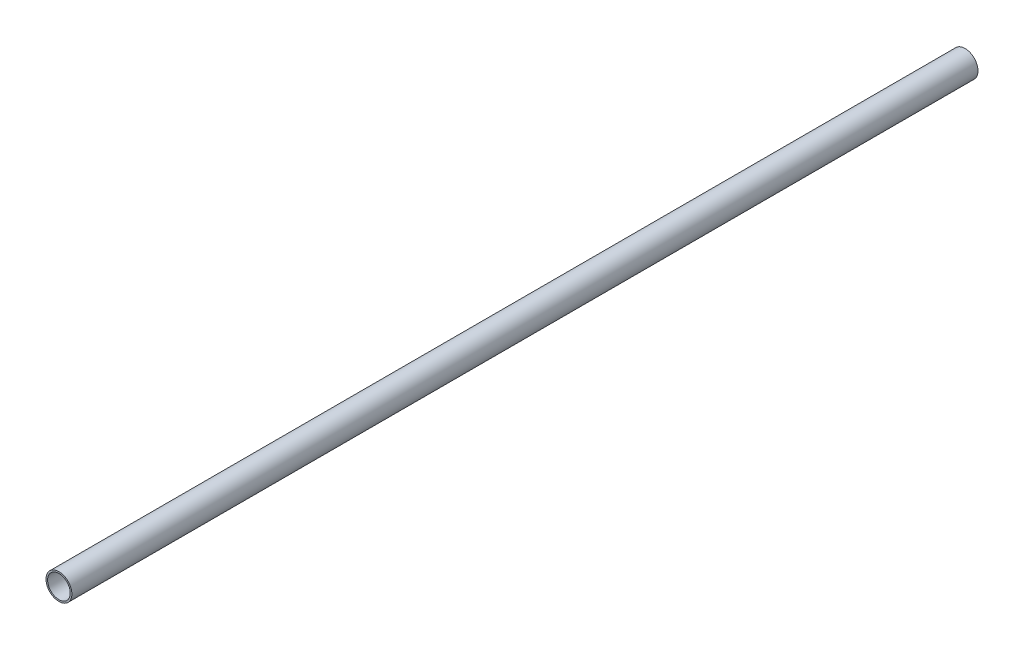
ISO-10303-21;
HEADER;
FILE_DESCRIPTION(('STEP AP214'),'2;1');
FILE_NAME('part.step','',(''),(''),'','','');
FILE_SCHEMA(('AUTOMOTIVE_DESIGN { 1 0 10303 214 1 1 1 1 }'));
ENDSEC;
DATA;
#1=APPLICATION_CONTEXT('core data for automotive mechanical design processes');
#2=APPLICATION_PROTOCOL_DEFINITION('international standard','automotive_design',2000,#1);
#3=PRODUCT_CONTEXT('',#1,'mechanical');
#4=PRODUCT('Part','Part','',(#3));
#5=PRODUCT_RELATED_PRODUCT_CATEGORY('part','',(#4));
#6=PRODUCT_DEFINITION_FORMATION('','',#4);
#7=PRODUCT_DEFINITION_CONTEXT('part definition',#1,'design');
#8=PRODUCT_DEFINITION('design','',#6,#7);
#9=PRODUCT_DEFINITION_SHAPE('','',#8);
#10=(LENGTH_UNIT() NAMED_UNIT(*) SI_UNIT(.MILLI.,.METRE.));
#11=(NAMED_UNIT(*) PLANE_ANGLE_UNIT() SI_UNIT($,.RADIAN.));
#12=(NAMED_UNIT(*) SI_UNIT($,.STERADIAN.) SOLID_ANGLE_UNIT());
#13=UNCERTAINTY_MEASURE_WITH_UNIT(LENGTH_MEASURE(1.E-05),#10,'distance_accuracy_value','');
#14=(GEOMETRIC_REPRESENTATION_CONTEXT(3) GLOBAL_UNCERTAINTY_ASSIGNED_CONTEXT((#13)) GLOBAL_UNIT_ASSIGNED_CONTEXT((#10,
#11,#12)) REPRESENTATION_CONTEXT('',''));
#15=CARTESIAN_POINT('',(0.,0.,0.));
#16=DIRECTION('',(0.,0.,1.));
#17=DIRECTION('',(1.,0.,0.));
#18=AXIS2_PLACEMENT_3D('',#15,#16,#17);
#19=CARTESIAN_POINT('',(0.,0.,140.));
#20=DIRECTION('',(0.,0.,1.));
#21=DIRECTION('',(1.,0.,0.));
#22=AXIS2_PLACEMENT_3D('',#19,#20,#21);
#23=PLANE('',#22);
#24=CARTESIAN_POINT('',(0.,0.,140.));
#25=DIRECTION('',(0.,0.,1.));
#26=DIRECTION('',(1.,0.,0.));
#27=AXIS2_PLACEMENT_3D('',#24,#25,#26);
#28=CIRCLE('',#27,4.);
#29=CARTESIAN_POINT('',(4.,0.,140.));
#30=VERTEX_POINT('',#29);
#31=EDGE_CURVE('E10',#30,#30,#28,.T.);
#32=ORIENTED_EDGE('',*,*,#31,.T.);
#33=EDGE_LOOP('',(#32));
#34=FACE_BOUND('',#33,.T.);
#35=CARTESIAN_POINT('',(0.,0.,140.));
#36=DIRECTION('',(0.,0.,1.));
#37=DIRECTION('',(1.,0.,0.));
#38=AXIS2_PLACEMENT_3D('',#35,#36,#37);
#39=CIRCLE('',#38,3.5);
#40=CARTESIAN_POINT('',(3.5,0.,140.));
#41=VERTEX_POINT('',#40);
#42=EDGE_CURVE('E42',#41,#41,#39,.T.);
#43=ORIENTED_EDGE('',*,*,#42,.F.);
#44=EDGE_LOOP('',(#43));
#45=FACE_BOUND('',#44,.T.);
#46=ADVANCED_FACE('F31',(#34,#45),#23,.T.);
#47=CARTESIAN_POINT('',(0.,0.,-140.));
#48=DIRECTION('',(0.,0.,1.));
#49=DIRECTION('',(1.,0.,0.));
#50=AXIS2_PLACEMENT_3D('',#47,#48,#49);
#51=PLANE('',#50);
#52=CARTESIAN_POINT('',(0.,0.,-140.));
#53=DIRECTION('',(0.,0.,1.));
#54=DIRECTION('',(1.,0.,0.));
#55=AXIS2_PLACEMENT_3D('',#52,#53,#54);
#56=CIRCLE('',#55,4.);
#57=CARTESIAN_POINT('',(4.,0.,-140.));
#58=VERTEX_POINT('',#57);
#59=EDGE_CURVE('E35',#58,#58,#56,.T.);
#60=ORIENTED_EDGE('',*,*,#59,.F.);
#61=EDGE_LOOP('',(#60));
#62=FACE_BOUND('',#61,.T.);
#63=CARTESIAN_POINT('',(0.,0.,-140.));
#64=DIRECTION('',(0.,0.,1.));
#65=DIRECTION('',(1.,0.,0.));
#66=AXIS2_PLACEMENT_3D('',#63,#64,#65);
#67=CIRCLE('',#66,3.5);
#68=CARTESIAN_POINT('',(3.5,0.,-140.));
#69=VERTEX_POINT('',#68);
#70=EDGE_CURVE('E44',#69,#69,#67,.T.);
#71=ORIENTED_EDGE('',*,*,#70,.T.);
#72=EDGE_LOOP('',(#71));
#73=FACE_BOUND('',#72,.T.);
#74=ADVANCED_FACE('F54',(#62,#73),#51,.F.);
#75=CARTESIAN_POINT('',(0.,0.,140.));
#76=DIRECTION('',(0.,0.,-1.));
#77=DIRECTION('',(-1.,0.,0.));
#78=AXIS2_PLACEMENT_3D('',#75,#76,#77);
#79=CYLINDRICAL_SURFACE('',#78,4.);
#80=ORIENTED_EDGE('',*,*,#31,.F.);
#81=EDGE_LOOP('',(#80));
#82=FACE_BOUND('',#81,.T.);
#83=ORIENTED_EDGE('',*,*,#59,.T.);
#84=EDGE_LOOP('',(#83));
#85=FACE_BOUND('',#84,.T.);
#86=ADVANCED_FACE('F33',(#82,#85),#79,.T.);
#87=CARTESIAN_POINT('',(0.,0.,140.));
#88=DIRECTION('',(0.,0.,-1.));
#89=DIRECTION('',(-1.,0.,0.));
#90=AXIS2_PLACEMENT_3D('',#87,#88,#89);
#91=CYLINDRICAL_SURFACE('',#90,3.5);
#92=ORIENTED_EDGE('',*,*,#42,.T.);
#93=EDGE_LOOP('',(#92));
#94=FACE_BOUND('',#93,.T.);
#95=ORIENTED_EDGE('',*,*,#70,.F.);
#96=EDGE_LOOP('',(#95));
#97=FACE_BOUND('',#96,.T.);
#98=ADVANCED_FACE('F50',(#94,#97),#91,.F.);
#99=CLOSED_SHELL('',(#46,#74,#86,#98));
#100=MANIFOLD_SOLID_BREP('B2',#99);
#101=ADVANCED_BREP_SHAPE_REPRESENTATION('',(#18,#100),#14);
#102=SHAPE_DEFINITION_REPRESENTATION(#9,#101);
ENDSEC;
END-ISO-10303-21;
